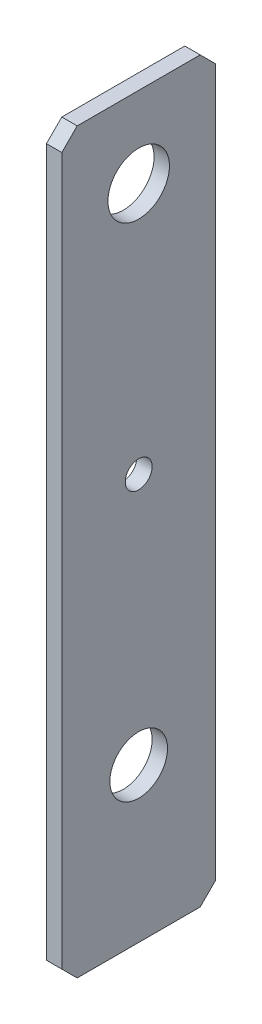
ISO-10303-21;
HEADER;
FILE_DESCRIPTION(('STEP AP214'),'2;1');
FILE_NAME('part.step','',(''),(''),'','','');
FILE_SCHEMA(('AUTOMOTIVE_DESIGN { 1 0 10303 214 1 1 1 1 }'));
ENDSEC;
DATA;
#1=APPLICATION_CONTEXT('core data for automotive mechanical design processes');
#2=APPLICATION_PROTOCOL_DEFINITION('international standard','automotive_design',2000,#1);
#3=PRODUCT_CONTEXT('',#1,'mechanical');
#4=PRODUCT('Part','Part','',(#3));
#5=PRODUCT_RELATED_PRODUCT_CATEGORY('part','',(#4));
#6=PRODUCT_DEFINITION_FORMATION('','',#4);
#7=PRODUCT_DEFINITION_CONTEXT('part definition',#1,'design');
#8=PRODUCT_DEFINITION('design','',#6,#7);
#9=PRODUCT_DEFINITION_SHAPE('','',#8);
#10=(LENGTH_UNIT() NAMED_UNIT(*) SI_UNIT(.MILLI.,.METRE.));
#11=(NAMED_UNIT(*) PLANE_ANGLE_UNIT() SI_UNIT($,.RADIAN.));
#12=(NAMED_UNIT(*) SI_UNIT($,.STERADIAN.) SOLID_ANGLE_UNIT());
#13=UNCERTAINTY_MEASURE_WITH_UNIT(LENGTH_MEASURE(1.E-05),#10,'distance_accuracy_value','');
#14=(GEOMETRIC_REPRESENTATION_CONTEXT(3) GLOBAL_UNCERTAINTY_ASSIGNED_CONTEXT((#13)) GLOBAL_UNIT_ASSIGNED_CONTEXT((#10,
#11,#12)) REPRESENTATION_CONTEXT('',''));
#15=CARTESIAN_POINT('',(0.,0.,0.));
#16=DIRECTION('',(0.,0.,1.));
#17=DIRECTION('',(1.,0.,0.));
#18=AXIS2_PLACEMENT_3D('',#15,#16,#17);
#19=CARTESIAN_POINT('',(2.,0.,0.));
#20=DIRECTION('',(0.,0.,-1.));
#21=DIRECTION('',(-1.,0.,0.));
#22=AXIS2_PLACEMENT_3D('',#19,#20,#21);
#23=PLANE('',#22);
#24=DIRECTION('',(0.,-1.,0.));
#25=VECTOR('',#24,1.);
#26=CARTESIAN_POINT('',(0.,0.,0.));
#27=LINE('',#26,#25);
#28=CARTESIAN_POINT('',(0.,94.,0.));
#29=VERTEX_POINT('',#28);
#30=CARTESIAN_POINT('',(0.,2.00000000000003,0.));
#31=VERTEX_POINT('',#30);
#32=EDGE_CURVE('E153',#29,#31,#27,.T.);
#33=ORIENTED_EDGE('',*,*,#32,.T.);
#34=DIRECTION('',(1.,0.,0.));
#35=VECTOR('',#34,1.);
#36=CARTESIAN_POINT('',(2.,2.00000000000003,0.));
#37=LINE('',#36,#35);
#38=CARTESIAN_POINT('',(2.,2.00000000000003,0.));
#39=VERTEX_POINT('',#38);
#40=EDGE_CURVE('E186',#31,#39,#37,.T.);
#41=ORIENTED_EDGE('',*,*,#40,.T.);
#42=DIRECTION('',(0.,-1.,0.));
#43=VECTOR('',#42,1.);
#44=CARTESIAN_POINT('',(2.,0.,0.));
#45=LINE('',#44,#43);
#46=CARTESIAN_POINT('',(2.,94.,0.));
#47=VERTEX_POINT('',#46);
#48=EDGE_CURVE('E151',#47,#39,#45,.T.);
#49=ORIENTED_EDGE('',*,*,#48,.F.);
#50=DIRECTION('',(-1.,0.,0.));
#51=VECTOR('',#50,1.);
#52=CARTESIAN_POINT('',(2.,94.,0.));
#53=LINE('',#52,#51);
#54=EDGE_CURVE('E182',#47,#29,#53,.T.);
#55=ORIENTED_EDGE('',*,*,#54,.T.);
#56=EDGE_LOOP('',(#33,#41,#49,#55));
#57=FACE_BOUND('',#56,.T.);
#58=ADVANCED_FACE('F49',(#57),#23,.F.);
#59=CARTESIAN_POINT('',(2.,0.,0.));
#60=DIRECTION('',(0.,1.,0.));
#61=DIRECTION('',(0.,0.,1.));
#62=AXIS2_PLACEMENT_3D('',#59,#60,#61);
#63=PLANE('',#62);
#64=DIRECTION('',(0.,0.,-1.));
#65=VECTOR('',#64,1.);
#66=CARTESIAN_POINT('',(0.,0.,0.));
#67=LINE('',#66,#65);
#68=CARTESIAN_POINT('',(0.,0.,-2.00000000000002));
#69=VERTEX_POINT('',#68);
#70=CARTESIAN_POINT('',(0.,0.,-18.));
#71=VERTEX_POINT('',#70);
#72=EDGE_CURVE('E147',#69,#71,#67,.T.);
#73=ORIENTED_EDGE('',*,*,#72,.T.);
#74=DIRECTION('',(1.,0.,0.));
#75=VECTOR('',#74,1.);
#76=CARTESIAN_POINT('',(2.,0.,-18.));
#77=LINE('',#76,#75);
#78=CARTESIAN_POINT('',(2.,0.,-18.));
#79=VERTEX_POINT('',#78);
#80=EDGE_CURVE('E122',#71,#79,#77,.T.);
#81=ORIENTED_EDGE('',*,*,#80,.T.);
#82=DIRECTION('',(0.,0.,-1.));
#83=VECTOR('',#82,1.);
#84=CARTESIAN_POINT('',(2.,0.,0.));
#85=LINE('',#84,#83);
#86=CARTESIAN_POINT('',(2.,0.,-2.00000000000002));
#87=VERTEX_POINT('',#86);
#88=EDGE_CURVE('E193',#87,#79,#85,.T.);
#89=ORIENTED_EDGE('',*,*,#88,.F.);
#90=DIRECTION('',(-1.,0.,0.));
#91=VECTOR('',#90,1.);
#92=CARTESIAN_POINT('',(2.,0.,-2.00000000000002));
#93=LINE('',#92,#91);
#94=EDGE_CURVE('E128',#87,#69,#93,.T.);
#95=ORIENTED_EDGE('',*,*,#94,.T.);
#96=EDGE_LOOP('',(#73,#81,#89,#95));
#97=FACE_BOUND('',#96,.T.);
#98=ADVANCED_FACE('F253',(#97),#63,.F.);
#99=CARTESIAN_POINT('',(2.,0.,-20.));
#100=DIRECTION('',(0.,0.,1.));
#101=DIRECTION('',(1.,0.,0.));
#102=AXIS2_PLACEMENT_3D('',#99,#100,#101);
#103=PLANE('',#102);
#104=DIRECTION('',(0.,1.,0.));
#105=VECTOR('',#104,1.);
#106=CARTESIAN_POINT('',(2.,0.,-20.));
#107=LINE('',#106,#105);
#108=CARTESIAN_POINT('',(2.,2.00000000000002,-20.));
#109=VERTEX_POINT('',#108);
#110=CARTESIAN_POINT('',(2.,94.,-20.));
#111=VERTEX_POINT('',#110);
#112=EDGE_CURVE('E137',#109,#111,#107,.T.);
#113=ORIENTED_EDGE('',*,*,#112,.F.);
#114=DIRECTION('',(-1.,0.,0.));
#115=VECTOR('',#114,1.);
#116=CARTESIAN_POINT('',(2.,2.00000000000002,-20.));
#117=LINE('',#116,#115);
#118=CARTESIAN_POINT('',(0.,2.00000000000002,-20.));
#119=VERTEX_POINT('',#118);
#120=EDGE_CURVE('E121',#109,#119,#117,.T.);
#121=ORIENTED_EDGE('',*,*,#120,.T.);
#122=DIRECTION('',(0.,1.,0.));
#123=VECTOR('',#122,1.);
#124=CARTESIAN_POINT('',(0.,0.,-20.));
#125=LINE('',#124,#123);
#126=CARTESIAN_POINT('',(0.,94.,-20.));
#127=VERTEX_POINT('',#126);
#128=EDGE_CURVE('E135',#119,#127,#125,.T.);
#129=ORIENTED_EDGE('',*,*,#128,.T.);
#130=DIRECTION('',(1.,0.,0.));
#131=VECTOR('',#130,1.);
#132=CARTESIAN_POINT('',(2.,94.,-20.));
#133=LINE('',#132,#131);
#134=EDGE_CURVE('E140',#127,#111,#133,.T.);
#135=ORIENTED_EDGE('',*,*,#134,.T.);
#136=EDGE_LOOP('',(#113,#121,#129,#135));
#137=FACE_BOUND('',#136,.T.);
#138=ADVANCED_FACE('F134',(#137),#103,.F.);
#139=CARTESIAN_POINT('',(2.,96.,0.));
#140=DIRECTION('',(0.,-1.,0.));
#141=DIRECTION('',(0.,0.,-1.));
#142=AXIS2_PLACEMENT_3D('',#139,#140,#141);
#143=PLANE('',#142);
#144=DIRECTION('',(0.,0.,1.));
#145=VECTOR('',#144,1.);
#146=CARTESIAN_POINT('',(2.,96.,0.));
#147=LINE('',#146,#145);
#148=CARTESIAN_POINT('',(2.,96.,-18.));
#149=VERTEX_POINT('',#148);
#150=CARTESIAN_POINT('',(2.,96.,-2.00000000000002));
#151=VERTEX_POINT('',#150);
#152=EDGE_CURVE('E158',#149,#151,#147,.T.);
#153=ORIENTED_EDGE('',*,*,#152,.F.);
#154=DIRECTION('',(-1.,0.,0.));
#155=VECTOR('',#154,1.);
#156=CARTESIAN_POINT('',(2.,96.,-18.));
#157=LINE('',#156,#155);
#158=CARTESIAN_POINT('',(0.,96.,-18.));
#159=VERTEX_POINT('',#158);
#160=EDGE_CURVE('E11',#149,#159,#157,.T.);
#161=ORIENTED_EDGE('',*,*,#160,.T.);
#162=DIRECTION('',(0.,0.,1.));
#163=VECTOR('',#162,1.);
#164=CARTESIAN_POINT('',(0.,96.,0.));
#165=LINE('',#164,#163);
#166=CARTESIAN_POINT('',(0.,96.,-2.00000000000002));
#167=VERTEX_POINT('',#166);
#168=EDGE_CURVE('E146',#159,#167,#165,.T.);
#169=ORIENTED_EDGE('',*,*,#168,.T.);
#170=DIRECTION('',(1.,0.,0.));
#171=VECTOR('',#170,1.);
#172=CARTESIAN_POINT('',(2.,96.,-2.00000000000002));
#173=LINE('',#172,#171);
#174=EDGE_CURVE('E59',#167,#151,#173,.T.);
#175=ORIENTED_EDGE('',*,*,#174,.T.);
#176=EDGE_LOOP('',(#153,#161,#169,#175));
#177=FACE_BOUND('',#176,.T.);
#178=ADVANCED_FACE('F285',(#177),#143,.F.);
#179=CARTESIAN_POINT('',(2.,0.,0.));
#180=DIRECTION('',(-1.,0.,0.));
#181=DIRECTION('',(0.,0.,1.));
#182=AXIS2_PLACEMENT_3D('',#179,#180,#181);
#183=PLANE('',#182);
#184=CARTESIAN_POINT('',(2.,85.5,-10.));
#185=DIRECTION('',(1.,0.,0.));
#186=DIRECTION('',(0.,0.,-1.));
#187=AXIS2_PLACEMENT_3D('',#184,#185,#186);
#188=CIRCLE('',#187,4.);
#189=CARTESIAN_POINT('',(2.,85.5,-14.));
#190=VERTEX_POINT('',#189);
#191=EDGE_CURVE('E213',#190,#190,#188,.T.);
#192=ORIENTED_EDGE('',*,*,#191,.F.);
#193=EDGE_LOOP('',(#192));
#194=FACE_BOUND('',#193,.T.);
#195=CARTESIAN_POINT('',(2.,52.75,-10.));
#196=DIRECTION('',(1.,0.,0.));
#197=DIRECTION('',(0.,0.,-1.));
#198=AXIS2_PLACEMENT_3D('',#195,#196,#197);
#199=CIRCLE('',#198,1.75);
#200=CARTESIAN_POINT('',(2.,52.75,-11.75));
#201=VERTEX_POINT('',#200);
#202=EDGE_CURVE('E219',#201,#201,#199,.T.);
#203=ORIENTED_EDGE('',*,*,#202,.F.);
#204=EDGE_LOOP('',(#203));
#205=FACE_BOUND('',#204,.T.);
#206=CARTESIAN_POINT('',(2.,20.,-10.));
#207=DIRECTION('',(1.,0.,0.));
#208=DIRECTION('',(0.,0.,-1.));
#209=AXIS2_PLACEMENT_3D('',#206,#207,#208);
#210=CIRCLE('',#209,3.75);
#211=CARTESIAN_POINT('',(2.,20.,-13.75));
#212=VERTEX_POINT('',#211);
#213=EDGE_CURVE('E228',#212,#212,#210,.T.);
#214=ORIENTED_EDGE('',*,*,#213,.F.);
#215=EDGE_LOOP('',(#214));
#216=FACE_BOUND('',#215,.T.);
#217=ORIENTED_EDGE('',*,*,#88,.T.);
#218=DIRECTION('',(0.,-0.707106781186545,0.70710678118655));
#219=VECTOR('',#218,1.);
#220=CARTESIAN_POINT('',(2.,2.00000000000002,-20.));
#221=LINE('',#220,#219);
#222=EDGE_CURVE('E179',#79,#109,#221,.F.);
#223=ORIENTED_EDGE('',*,*,#222,.T.);
#224=ORIENTED_EDGE('',*,*,#112,.T.);
#225=DIRECTION('',(0.,-0.70710678118655,-0.707106781186545));
#226=VECTOR('',#225,1.);
#227=CARTESIAN_POINT('',(2.,96.,-18.));
#228=LINE('',#227,#226);
#229=EDGE_CURVE('E72',#111,#149,#228,.F.);
#230=ORIENTED_EDGE('',*,*,#229,.T.);
#231=ORIENTED_EDGE('',*,*,#152,.T.);
#232=DIRECTION('',(0.,0.707106781186545,-0.70710678118655));
#233=VECTOR('',#232,1.);
#234=CARTESIAN_POINT('',(2.,94.,0.));
#235=LINE('',#234,#233);
#236=EDGE_CURVE('E171',#151,#47,#235,.F.);
#237=ORIENTED_EDGE('',*,*,#236,.T.);
#238=ORIENTED_EDGE('',*,*,#48,.T.);
#239=DIRECTION('',(0.,0.70710678118655,0.707106781186545));
#240=VECTOR('',#239,1.);
#241=CARTESIAN_POINT('',(2.,0.,-2.00000000000002));
#242=LINE('',#241,#240);
#243=EDGE_CURVE('E176',#39,#87,#242,.F.);
#244=ORIENTED_EDGE('',*,*,#243,.T.);
#245=EDGE_LOOP('',(#217,#223,#224,#230,#231,#237,#238,#244));
#246=FACE_BOUND('',#245,.T.);
#247=ADVANCED_FACE('F249',(#194,#205,#216,#246),#183,.F.);
#248=CARTESIAN_POINT('',(0.,0.,0.));
#249=DIRECTION('',(-1.,0.,0.));
#250=DIRECTION('',(0.,0.,1.));
#251=AXIS2_PLACEMENT_3D('',#248,#249,#250);
#252=PLANE('',#251);
#253=CARTESIAN_POINT('',(0.,85.5,-10.));
#254=DIRECTION('',(1.,0.,0.));
#255=DIRECTION('',(0.,0.,-1.));
#256=AXIS2_PLACEMENT_3D('',#253,#254,#255);
#257=CIRCLE('',#256,4.);
#258=CARTESIAN_POINT('',(0.,85.5,-14.));
#259=VERTEX_POINT('',#258);
#260=EDGE_CURVE('E207',#259,#259,#257,.T.);
#261=ORIENTED_EDGE('',*,*,#260,.T.);
#262=EDGE_LOOP('',(#261));
#263=FACE_BOUND('',#262,.T.);
#264=CARTESIAN_POINT('',(0.,52.75,-10.));
#265=DIRECTION('',(1.,0.,0.));
#266=DIRECTION('',(0.,0.,-1.));
#267=AXIS2_PLACEMENT_3D('',#264,#265,#266);
#268=CIRCLE('',#267,1.75);
#269=CARTESIAN_POINT('',(0.,52.75,-11.75));
#270=VERTEX_POINT('',#269);
#271=EDGE_CURVE('E225',#270,#270,#268,.T.);
#272=ORIENTED_EDGE('',*,*,#271,.T.);
#273=EDGE_LOOP('',(#272));
#274=FACE_BOUND('',#273,.T.);
#275=CARTESIAN_POINT('',(0.,20.,-10.));
#276=DIRECTION('',(1.,0.,0.));
#277=DIRECTION('',(0.,0.,-1.));
#278=AXIS2_PLACEMENT_3D('',#275,#276,#277);
#279=CIRCLE('',#278,3.75);
#280=CARTESIAN_POINT('',(0.,20.,-13.75));
#281=VERTEX_POINT('',#280);
#282=EDGE_CURVE('E203',#281,#281,#279,.T.);
#283=ORIENTED_EDGE('',*,*,#282,.T.);
#284=EDGE_LOOP('',(#283));
#285=FACE_BOUND('',#284,.T.);
#286=ORIENTED_EDGE('',*,*,#128,.F.);
#287=DIRECTION('',(0.,0.707106781186545,-0.70710678118655));
#288=VECTOR('',#287,1.);
#289=CARTESIAN_POINT('',(0.,-8.99999999999999,-8.99999999999992));
#290=LINE('',#289,#288);
#291=EDGE_CURVE('E117',#119,#71,#290,.F.);
#292=ORIENTED_EDGE('',*,*,#291,.T.);
#293=ORIENTED_EDGE('',*,*,#72,.F.);
#294=DIRECTION('',(0.,-0.70710678118655,-0.707106781186545));
#295=VECTOR('',#294,1.);
#296=CARTESIAN_POINT('',(0.,1.00000000000001,-1.00000000000001));
#297=LINE('',#296,#295);
#298=EDGE_CURVE('E129',#69,#31,#297,.F.);
#299=ORIENTED_EDGE('',*,*,#298,.T.);
#300=ORIENTED_EDGE('',*,*,#32,.F.);
#301=DIRECTION('',(0.,-0.707106781186545,0.70710678118655));
#302=VECTOR('',#301,1.);
#303=CARTESIAN_POINT('',(0.,47.0000000000003,47.));
#304=LINE('',#303,#302);
#305=EDGE_CURVE('E139',#29,#167,#304,.F.);
#306=ORIENTED_EDGE('',*,*,#305,.T.);
#307=ORIENTED_EDGE('',*,*,#168,.F.);
#308=DIRECTION('',(0.,0.70710678118655,0.707106781186545));
#309=VECTOR('',#308,1.);
#310=CARTESIAN_POINT('',(0.,56.9999999999997,-57.0000000000001));
#311=LINE('',#310,#309);
#312=EDGE_CURVE('E144',#159,#127,#311,.F.);
#313=ORIENTED_EDGE('',*,*,#312,.T.);
#314=EDGE_LOOP('',(#286,#292,#293,#299,#300,#306,#307,#313));
#315=FACE_BOUND('',#314,.T.);
#316=ADVANCED_FACE('F142',(#263,#274,#285,#315),#252,.T.);
#317=CARTESIAN_POINT('',(0.,20.,-10.));
#318=DIRECTION('',(1.,0.,0.));
#319=DIRECTION('',(0.,0.,-1.));
#320=AXIS2_PLACEMENT_3D('',#317,#318,#319);
#321=CYLINDRICAL_SURFACE('',#320,3.75);
#322=ORIENTED_EDGE('',*,*,#282,.F.);
#323=EDGE_LOOP('',(#322));
#324=FACE_BOUND('',#323,.T.);
#325=ORIENTED_EDGE('',*,*,#213,.T.);
#326=EDGE_LOOP('',(#325));
#327=FACE_BOUND('',#326,.T.);
#328=ADVANCED_FACE('F238',(#324,#327),#321,.F.);
#329=CARTESIAN_POINT('',(0.,52.75,-10.));
#330=DIRECTION('',(1.,0.,0.));
#331=DIRECTION('',(0.,0.,-1.));
#332=AXIS2_PLACEMENT_3D('',#329,#330,#331);
#333=CYLINDRICAL_SURFACE('',#332,1.75);
#334=ORIENTED_EDGE('',*,*,#271,.F.);
#335=EDGE_LOOP('',(#334));
#336=FACE_BOUND('',#335,.T.);
#337=ORIENTED_EDGE('',*,*,#202,.T.);
#338=EDGE_LOOP('',(#337));
#339=FACE_BOUND('',#338,.T.);
#340=ADVANCED_FACE('F240',(#336,#339),#333,.F.);
#341=CARTESIAN_POINT('',(0.,85.5,-10.));
#342=DIRECTION('',(1.,0.,0.));
#343=DIRECTION('',(0.,0.,-1.));
#344=AXIS2_PLACEMENT_3D('',#341,#342,#343);
#345=CYLINDRICAL_SURFACE('',#344,4.);
#346=ORIENTED_EDGE('',*,*,#260,.F.);
#347=EDGE_LOOP('',(#346));
#348=FACE_BOUND('',#347,.T.);
#349=ORIENTED_EDGE('',*,*,#191,.T.);
#350=EDGE_LOOP('',(#349));
#351=FACE_BOUND('',#350,.T.);
#352=ADVANCED_FACE('F245',(#348,#351),#345,.F.);
#353=CARTESIAN_POINT('',(2.,2.00000000000002,-20.));
#354=DIRECTION('',(0.,0.70710678118655,0.707106781186545));
#355=DIRECTION('',(-1.,0.,0.));
#356=AXIS2_PLACEMENT_3D('',#353,#354,#355);
#357=PLANE('',#356);
#358=ORIENTED_EDGE('',*,*,#222,.F.);
#359=ORIENTED_EDGE('',*,*,#80,.F.);
#360=ORIENTED_EDGE('',*,*,#291,.F.);
#361=ORIENTED_EDGE('',*,*,#120,.F.);
#362=EDGE_LOOP('',(#358,#359,#360,#361));
#363=FACE_BOUND('',#362,.T.);
#364=ADVANCED_FACE('F120',(#363),#357,.F.);
#365=CARTESIAN_POINT('',(2.,0.,-2.00000000000002));
#366=DIRECTION('',(0.,0.707106781186545,-0.70710678118655));
#367=DIRECTION('',(-1.,0.,0.));
#368=AXIS2_PLACEMENT_3D('',#365,#366,#367);
#369=PLANE('',#368);
#370=ORIENTED_EDGE('',*,*,#243,.F.);
#371=ORIENTED_EDGE('',*,*,#40,.F.);
#372=ORIENTED_EDGE('',*,*,#298,.F.);
#373=ORIENTED_EDGE('',*,*,#94,.F.);
#374=EDGE_LOOP('',(#370,#371,#372,#373));
#375=FACE_BOUND('',#374,.T.);
#376=ADVANCED_FACE('F269',(#375),#369,.F.);
#377=CARTESIAN_POINT('',(2.,96.,-18.));
#378=DIRECTION('',(0.,-0.707106781186545,0.70710678118655));
#379=DIRECTION('',(-1.,0.,0.));
#380=AXIS2_PLACEMENT_3D('',#377,#378,#379);
#381=PLANE('',#380);
#382=ORIENTED_EDGE('',*,*,#229,.F.);
#383=ORIENTED_EDGE('',*,*,#134,.F.);
#384=ORIENTED_EDGE('',*,*,#312,.F.);
#385=ORIENTED_EDGE('',*,*,#160,.F.);
#386=EDGE_LOOP('',(#382,#383,#384,#385));
#387=FACE_BOUND('',#386,.T.);
#388=ADVANCED_FACE('F274',(#387),#381,.F.);
#389=CARTESIAN_POINT('',(2.,94.,0.));
#390=DIRECTION('',(0.,-0.70710678118655,-0.707106781186545));
#391=DIRECTION('',(-1.,0.,0.));
#392=AXIS2_PLACEMENT_3D('',#389,#390,#391);
#393=PLANE('',#392);
#394=ORIENTED_EDGE('',*,*,#236,.F.);
#395=ORIENTED_EDGE('',*,*,#174,.F.);
#396=ORIENTED_EDGE('',*,*,#305,.F.);
#397=ORIENTED_EDGE('',*,*,#54,.F.);
#398=EDGE_LOOP('',(#394,#395,#396,#397));
#399=FACE_BOUND('',#398,.T.);
#400=ADVANCED_FACE('F52',(#399),#393,.F.);
#401=CLOSED_SHELL('',(#58,#98,#138,#178,#247,#316,#328,#340,#352,#364,#376,#388,#400));
#402=MANIFOLD_SOLID_BREP('B2',#401);
#403=ADVANCED_BREP_SHAPE_REPRESENTATION('',(#18,#402),#14);
#404=SHAPE_DEFINITION_REPRESENTATION(#9,#403);
ENDSEC;
END-ISO-10303-21;
